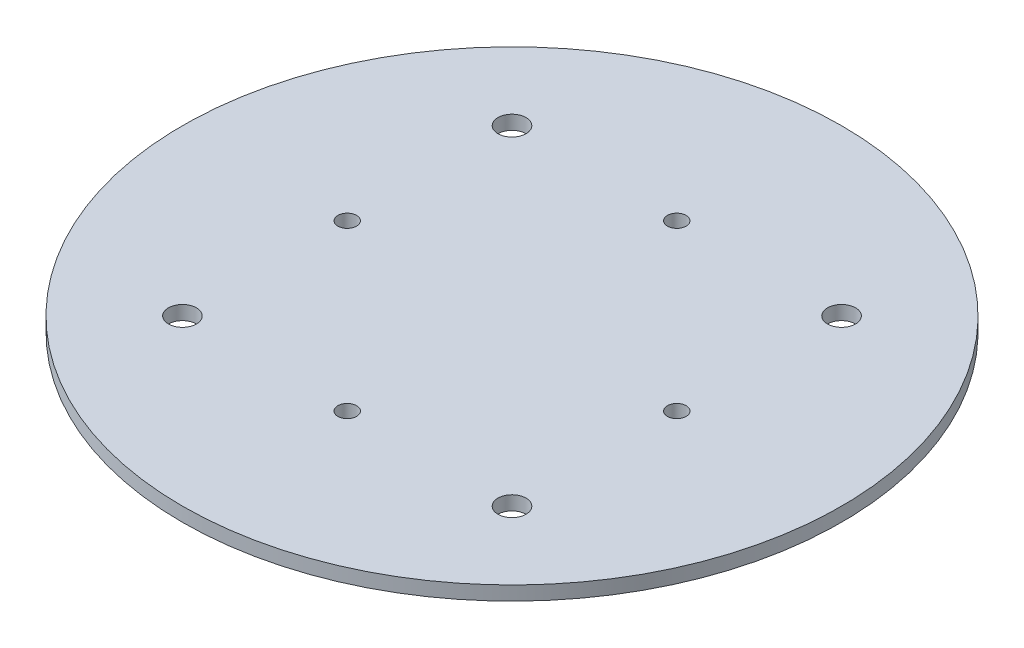
ISO-10303-21;
HEADER;
FILE_DESCRIPTION(('STEP AP214'),'2;1');
FILE_NAME('part.step','',(''),(''),'','','');
FILE_SCHEMA(('AUTOMOTIVE_DESIGN { 1 0 10303 214 1 1 1 1 }'));
ENDSEC;
DATA;
#1=APPLICATION_CONTEXT('core data for automotive mechanical design processes');
#2=APPLICATION_PROTOCOL_DEFINITION('international standard','automotive_design',2000,#1);
#3=PRODUCT_CONTEXT('',#1,'mechanical');
#4=PRODUCT('Part','Part','',(#3));
#5=PRODUCT_RELATED_PRODUCT_CATEGORY('part','',(#4));
#6=PRODUCT_DEFINITION_FORMATION('','',#4);
#7=PRODUCT_DEFINITION_CONTEXT('part definition',#1,'design');
#8=PRODUCT_DEFINITION('design','',#6,#7);
#9=PRODUCT_DEFINITION_SHAPE('','',#8);
#10=(LENGTH_UNIT() NAMED_UNIT(*) SI_UNIT(.MILLI.,.METRE.));
#11=(NAMED_UNIT(*) PLANE_ANGLE_UNIT() SI_UNIT($,.RADIAN.));
#12=(NAMED_UNIT(*) SI_UNIT($,.STERADIAN.) SOLID_ANGLE_UNIT());
#13=UNCERTAINTY_MEASURE_WITH_UNIT(LENGTH_MEASURE(1.E-05),#10,'distance_accuracy_value','');
#14=(GEOMETRIC_REPRESENTATION_CONTEXT(3) GLOBAL_UNCERTAINTY_ASSIGNED_CONTEXT((#13)) GLOBAL_UNIT_ASSIGNED_CONTEXT((#10,
#11,#12)) REPRESENTATION_CONTEXT('',''));
#15=CARTESIAN_POINT('',(0.,0.,0.));
#16=DIRECTION('',(0.,0.,1.));
#17=DIRECTION('',(1.,0.,0.));
#18=AXIS2_PLACEMENT_3D('',#15,#16,#17);
#19=CARTESIAN_POINT('',(0.,3.,0.));
#20=DIRECTION('',(0.,-1.,0.));
#21=DIRECTION('',(0.,0.,-1.));
#22=AXIS2_PLACEMENT_3D('',#19,#20,#21);
#23=CYLINDRICAL_SURFACE('',#22,70.4999999999991);
#24=CARTESIAN_POINT('',(0.,3.,0.));
#25=DIRECTION('',(0.,1.,0.));
#26=DIRECTION('',(0.,0.,1.));
#27=AXIS2_PLACEMENT_3D('',#24,#25,#26);
#28=CIRCLE('',#27,70.4999999999991);
#29=CARTESIAN_POINT('',(0.,3.,70.4999999999991));
#30=VERTEX_POINT('',#29);
#31=EDGE_CURVE('E10',#30,#30,#28,.T.);
#32=ORIENTED_EDGE('',*,*,#31,.F.);
#33=EDGE_LOOP('',(#32));
#34=FACE_BOUND('',#33,.T.);
#35=CARTESIAN_POINT('',(0.,0.,0.));
#36=DIRECTION('',(0.,1.,0.));
#37=DIRECTION('',(0.,0.,1.));
#38=AXIS2_PLACEMENT_3D('',#35,#36,#37);
#39=CIRCLE('',#38,70.4999999999991);
#40=CARTESIAN_POINT('',(0.,0.,70.4999999999991));
#41=VERTEX_POINT('',#40);
#42=EDGE_CURVE('E34',#41,#41,#39,.T.);
#43=ORIENTED_EDGE('',*,*,#42,.T.);
#44=EDGE_LOOP('',(#43));
#45=FACE_BOUND('',#44,.T.);
#46=ADVANCED_FACE('F31',(#34,#45),#23,.T.);
#47=CARTESIAN_POINT('',(0.,3.,0.));
#48=DIRECTION('',(0.,1.,0.));
#49=DIRECTION('',(0.,0.,1.));
#50=AXIS2_PLACEMENT_3D('',#47,#48,#49);
#51=PLANE('',#50);
#52=CARTESIAN_POINT('',(-35.2499999999991,3.,-35.2499999999991));
#53=DIRECTION('',(0.,-1.,0.));
#54=DIRECTION('',(0.,0.,-1.));
#55=AXIS2_PLACEMENT_3D('',#52,#53,#54);
#56=CIRCLE('',#55,3.);
#57=CARTESIAN_POINT('',(-35.2499999999991,3.,-38.2499999999991));
#58=VERTEX_POINT('',#57);
#59=EDGE_CURVE('E70',#58,#58,#56,.T.);
#60=ORIENTED_EDGE('',*,*,#59,.T.);
#61=EDGE_LOOP('',(#60));
#62=FACE_BOUND('',#61,.T.);
#63=CARTESIAN_POINT('',(35.2499999999991,3.,-35.2499999999991));
#64=DIRECTION('',(0.,-1.,0.));
#65=DIRECTION('',(0.,0.,-1.));
#66=AXIS2_PLACEMENT_3D('',#63,#64,#65);
#67=CIRCLE('',#66,3.00000000000001);
#68=CARTESIAN_POINT('',(35.2499999999991,3.,-38.2499999999991));
#69=VERTEX_POINT('',#68);
#70=EDGE_CURVE('E76',#69,#69,#67,.T.);
#71=ORIENTED_EDGE('',*,*,#70,.T.);
#72=EDGE_LOOP('',(#71));
#73=FACE_BOUND('',#72,.T.);
#74=CARTESIAN_POINT('',(0.,3.,35.2499999999991));
#75=DIRECTION('',(0.,-1.,0.));
#76=DIRECTION('',(0.,0.,-1.));
#77=AXIS2_PLACEMENT_3D('',#74,#75,#76);
#78=CIRCLE('',#77,2.);
#79=CARTESIAN_POINT('',(0.,3.,33.2499999999991));
#80=VERTEX_POINT('',#79);
#81=EDGE_CURVE('E82',#80,#80,#78,.T.);
#82=ORIENTED_EDGE('',*,*,#81,.T.);
#83=EDGE_LOOP('',(#82));
#84=FACE_BOUND('',#83,.T.);
#85=CARTESIAN_POINT('',(35.2499999999991,3.,35.2499999999991));
#86=DIRECTION('',(0.,-1.,0.));
#87=DIRECTION('',(0.,0.,-1.));
#88=AXIS2_PLACEMENT_3D('',#85,#86,#87);
#89=CIRCLE('',#88,3.);
#90=CARTESIAN_POINT('',(35.2499999999991,3.,32.2499999999991));
#91=VERTEX_POINT('',#90);
#92=EDGE_CURVE('E53',#91,#91,#89,.T.);
#93=ORIENTED_EDGE('',*,*,#92,.T.);
#94=EDGE_LOOP('',(#93));
#95=FACE_BOUND('',#94,.T.);
#96=CARTESIAN_POINT('',(35.2499999999991,3.,0.));
#97=DIRECTION('',(0.,-1.,0.));
#98=DIRECTION('',(0.,0.,-1.));
#99=AXIS2_PLACEMENT_3D('',#96,#97,#98);
#100=CIRCLE('',#99,2.);
#101=CARTESIAN_POINT('',(35.2499999999991,3.,-2.));
#102=VERTEX_POINT('',#101);
#103=EDGE_CURVE('E52',#102,#102,#100,.T.);
#104=ORIENTED_EDGE('',*,*,#103,.T.);
#105=EDGE_LOOP('',(#104));
#106=FACE_BOUND('',#105,.T.);
#107=CARTESIAN_POINT('',(0.,3.,-35.2499999999991));
#108=DIRECTION('',(0.,-1.,0.));
#109=DIRECTION('',(0.,0.,-1.));
#110=AXIS2_PLACEMENT_3D('',#107,#108,#109);
#111=CIRCLE('',#110,2.00000000000001);
#112=CARTESIAN_POINT('',(0.,3.,-37.2499999999991));
#113=VERTEX_POINT('',#112);
#114=EDGE_CURVE('E59',#113,#113,#111,.T.);
#115=ORIENTED_EDGE('',*,*,#114,.T.);
#116=EDGE_LOOP('',(#115));
#117=FACE_BOUND('',#116,.T.);
#118=CARTESIAN_POINT('',(-35.2499999999991,3.,35.2499999999991));
#119=DIRECTION('',(0.,-1.,0.));
#120=DIRECTION('',(0.,0.,-1.));
#121=AXIS2_PLACEMENT_3D('',#118,#119,#120);
#122=CIRCLE('',#121,3.);
#123=CARTESIAN_POINT('',(-35.2499999999991,3.,32.2499999999991));
#124=VERTEX_POINT('',#123);
#125=EDGE_CURVE('E46',#124,#124,#122,.T.);
#126=ORIENTED_EDGE('',*,*,#125,.T.);
#127=EDGE_LOOP('',(#126));
#128=FACE_BOUND('',#127,.T.);
#129=CARTESIAN_POINT('',(-35.2499999999991,3.,0.));
#130=DIRECTION('',(0.,-1.,0.));
#131=DIRECTION('',(0.,0.,-1.));
#132=AXIS2_PLACEMENT_3D('',#129,#130,#131);
#133=CIRCLE('',#132,2.);
#134=CARTESIAN_POINT('',(-35.2499999999991,3.,-2.));
#135=VERTEX_POINT('',#134);
#136=EDGE_CURVE('E41',#135,#135,#133,.T.);
#137=ORIENTED_EDGE('',*,*,#136,.T.);
#138=EDGE_LOOP('',(#137));
#139=FACE_BOUND('',#138,.T.);
#140=ORIENTED_EDGE('',*,*,#31,.T.);
#141=EDGE_LOOP('',(#140));
#142=FACE_BOUND('',#141,.T.);
#143=ADVANCED_FACE('F91',(#62,#73,#84,#95,#106,#117,#128,#139,#142),#51,.T.);
#144=CARTESIAN_POINT('',(0.,0.,0.));
#145=DIRECTION('',(0.,1.,0.));
#146=DIRECTION('',(0.,0.,1.));
#147=AXIS2_PLACEMENT_3D('',#144,#145,#146);
#148=PLANE('',#147);
#149=CARTESIAN_POINT('',(-35.2499999999991,0.,-35.2499999999991));
#150=DIRECTION('',(0.,-1.,0.));
#151=DIRECTION('',(0.,0.,-1.));
#152=AXIS2_PLACEMENT_3D('',#149,#150,#151);
#153=CIRCLE('',#152,3.);
#154=CARTESIAN_POINT('',(-35.2499999999991,0.,-38.2499999999991));
#155=VERTEX_POINT('',#154);
#156=EDGE_CURVE('E67',#155,#155,#153,.T.);
#157=ORIENTED_EDGE('',*,*,#156,.F.);
#158=EDGE_LOOP('',(#157));
#159=FACE_BOUND('',#158,.T.);
#160=CARTESIAN_POINT('',(35.2499999999991,0.,-35.2499999999991));
#161=DIRECTION('',(0.,-1.,0.));
#162=DIRECTION('',(0.,0.,-1.));
#163=AXIS2_PLACEMENT_3D('',#160,#161,#162);
#164=CIRCLE('',#163,3.00000000000001);
#165=CARTESIAN_POINT('',(35.2499999999991,0.,-38.2499999999991));
#166=VERTEX_POINT('',#165);
#167=EDGE_CURVE('E73',#166,#166,#164,.T.);
#168=ORIENTED_EDGE('',*,*,#167,.F.);
#169=EDGE_LOOP('',(#168));
#170=FACE_BOUND('',#169,.T.);
#171=CARTESIAN_POINT('',(0.,0.,35.2499999999991));
#172=DIRECTION('',(0.,-1.,0.));
#173=DIRECTION('',(0.,0.,-1.));
#174=AXIS2_PLACEMENT_3D('',#171,#172,#173);
#175=CIRCLE('',#174,2.);
#176=CARTESIAN_POINT('',(0.,0.,33.2499999999991));
#177=VERTEX_POINT('',#176);
#178=EDGE_CURVE('E79',#177,#177,#175,.T.);
#179=ORIENTED_EDGE('',*,*,#178,.F.);
#180=EDGE_LOOP('',(#179));
#181=FACE_BOUND('',#180,.T.);
#182=CARTESIAN_POINT('',(35.2499999999991,0.,35.2499999999991));
#183=DIRECTION('',(0.,-1.,0.));
#184=DIRECTION('',(0.,0.,-1.));
#185=AXIS2_PLACEMENT_3D('',#182,#183,#184);
#186=CIRCLE('',#185,3.);
#187=CARTESIAN_POINT('',(35.2499999999991,0.,32.2499999999991));
#188=VERTEX_POINT('',#187);
#189=EDGE_CURVE('E85',#188,#188,#186,.T.);
#190=ORIENTED_EDGE('',*,*,#189,.F.);
#191=EDGE_LOOP('',(#190));
#192=FACE_BOUND('',#191,.T.);
#193=CARTESIAN_POINT('',(35.2499999999991,0.,0.));
#194=DIRECTION('',(0.,-1.,0.));
#195=DIRECTION('',(0.,0.,-1.));
#196=AXIS2_PLACEMENT_3D('',#193,#194,#195);
#197=CIRCLE('',#196,2.);
#198=CARTESIAN_POINT('',(35.2499999999991,0.,-2.));
#199=VERTEX_POINT('',#198);
#200=EDGE_CURVE('E49',#199,#199,#197,.T.);
#201=ORIENTED_EDGE('',*,*,#200,.F.);
#202=EDGE_LOOP('',(#201));
#203=FACE_BOUND('',#202,.T.);
#204=CARTESIAN_POINT('',(0.,0.,-35.2499999999991));
#205=DIRECTION('',(0.,-1.,0.));
#206=DIRECTION('',(0.,0.,-1.));
#207=AXIS2_PLACEMENT_3D('',#204,#205,#206);
#208=CIRCLE('',#207,2.00000000000001);
#209=CARTESIAN_POINT('',(0.,0.,-37.2499999999991));
#210=VERTEX_POINT('',#209);
#211=EDGE_CURVE('E56',#210,#210,#208,.T.);
#212=ORIENTED_EDGE('',*,*,#211,.F.);
#213=EDGE_LOOP('',(#212));
#214=FACE_BOUND('',#213,.T.);
#215=CARTESIAN_POINT('',(-35.2499999999991,0.,35.2499999999991));
#216=DIRECTION('',(0.,-1.,0.));
#217=DIRECTION('',(0.,0.,-1.));
#218=AXIS2_PLACEMENT_3D('',#215,#216,#217);
#219=CIRCLE('',#218,3.);
#220=CARTESIAN_POINT('',(-35.2499999999991,0.,32.2499999999991));
#221=VERTEX_POINT('',#220);
#222=EDGE_CURVE('E62',#221,#221,#219,.T.);
#223=ORIENTED_EDGE('',*,*,#222,.F.);
#224=EDGE_LOOP('',(#223));
#225=FACE_BOUND('',#224,.T.);
#226=CARTESIAN_POINT('',(-35.2499999999991,0.,0.));
#227=DIRECTION('',(0.,-1.,0.));
#228=DIRECTION('',(0.,0.,-1.));
#229=AXIS2_PLACEMENT_3D('',#226,#227,#228);
#230=CIRCLE('',#229,2.);
#231=CARTESIAN_POINT('',(-35.2499999999991,0.,-2.));
#232=VERTEX_POINT('',#231);
#233=EDGE_CURVE('E43',#232,#232,#230,.T.);
#234=ORIENTED_EDGE('',*,*,#233,.F.);
#235=EDGE_LOOP('',(#234));
#236=FACE_BOUND('',#235,.T.);
#237=ORIENTED_EDGE('',*,*,#42,.F.);
#238=EDGE_LOOP('',(#237));
#239=FACE_BOUND('',#238,.T.);
#240=ADVANCED_FACE('F102',(#159,#170,#181,#192,#203,#214,#225,#236,#239),#148,.F.);
#241=CARTESIAN_POINT('',(-35.2499999999991,3.,0.));
#242=DIRECTION('',(0.,-1.,0.));
#243=DIRECTION('',(0.,0.,-1.));
#244=AXIS2_PLACEMENT_3D('',#241,#242,#243);
#245=CYLINDRICAL_SURFACE('',#244,2.);
#246=ORIENTED_EDGE('',*,*,#136,.F.);
#247=EDGE_LOOP('',(#246));
#248=FACE_BOUND('',#247,.T.);
#249=ORIENTED_EDGE('',*,*,#233,.T.);
#250=EDGE_LOOP('',(#249));
#251=FACE_BOUND('',#250,.T.);
#252=ADVANCED_FACE('F105',(#248,#251),#245,.F.);
#253=CARTESIAN_POINT('',(-35.2499999999991,3.,35.2499999999991));
#254=DIRECTION('',(0.,-1.,0.));
#255=DIRECTION('',(0.,0.,-1.));
#256=AXIS2_PLACEMENT_3D('',#253,#254,#255);
#257=CYLINDRICAL_SURFACE('',#256,3.);
#258=ORIENTED_EDGE('',*,*,#125,.F.);
#259=EDGE_LOOP('',(#258));
#260=FACE_BOUND('',#259,.T.);
#261=ORIENTED_EDGE('',*,*,#222,.T.);
#262=EDGE_LOOP('',(#261));
#263=FACE_BOUND('',#262,.T.);
#264=ADVANCED_FACE('F130',(#260,#263),#257,.F.);
#265=CARTESIAN_POINT('',(0.,3.,-35.2499999999991));
#266=DIRECTION('',(0.,-1.,0.));
#267=DIRECTION('',(0.,0.,-1.));
#268=AXIS2_PLACEMENT_3D('',#265,#266,#267);
#269=CYLINDRICAL_SURFACE('',#268,2.00000000000001);
#270=ORIENTED_EDGE('',*,*,#114,.F.);
#271=EDGE_LOOP('',(#270));
#272=FACE_BOUND('',#271,.T.);
#273=ORIENTED_EDGE('',*,*,#211,.T.);
#274=EDGE_LOOP('',(#273));
#275=FACE_BOUND('',#274,.T.);
#276=ADVANCED_FACE('F134',(#272,#275),#269,.F.);
#277=CARTESIAN_POINT('',(35.2499999999991,3.,0.));
#278=DIRECTION('',(0.,-1.,0.));
#279=DIRECTION('',(0.,0.,-1.));
#280=AXIS2_PLACEMENT_3D('',#277,#278,#279);
#281=CYLINDRICAL_SURFACE('',#280,2.);
#282=ORIENTED_EDGE('',*,*,#103,.F.);
#283=EDGE_LOOP('',(#282));
#284=FACE_BOUND('',#283,.T.);
#285=ORIENTED_EDGE('',*,*,#200,.T.);
#286=EDGE_LOOP('',(#285));
#287=FACE_BOUND('',#286,.T.);
#288=ADVANCED_FACE('F98',(#284,#287),#281,.F.);
#289=CARTESIAN_POINT('',(35.2499999999991,3.,35.2499999999991));
#290=DIRECTION('',(0.,-1.,0.));
#291=DIRECTION('',(0.,0.,-1.));
#292=AXIS2_PLACEMENT_3D('',#289,#290,#291);
#293=CYLINDRICAL_SURFACE('',#292,3.);
#294=ORIENTED_EDGE('',*,*,#92,.F.);
#295=EDGE_LOOP('',(#294));
#296=FACE_BOUND('',#295,.T.);
#297=ORIENTED_EDGE('',*,*,#189,.T.);
#298=EDGE_LOOP('',(#297));
#299=FACE_BOUND('',#298,.T.);
#300=ADVANCED_FACE('F94',(#296,#299),#293,.F.);
#301=CARTESIAN_POINT('',(0.,3.,35.2499999999991));
#302=DIRECTION('',(0.,-1.,0.));
#303=DIRECTION('',(0.,0.,-1.));
#304=AXIS2_PLACEMENT_3D('',#301,#302,#303);
#305=CYLINDRICAL_SURFACE('',#304,2.);
#306=ORIENTED_EDGE('',*,*,#81,.F.);
#307=EDGE_LOOP('',(#306));
#308=FACE_BOUND('',#307,.T.);
#309=ORIENTED_EDGE('',*,*,#178,.T.);
#310=EDGE_LOOP('',(#309));
#311=FACE_BOUND('',#310,.T.);
#312=ADVANCED_FACE('F97',(#308,#311),#305,.F.);
#313=CARTESIAN_POINT('',(35.2499999999991,3.,-35.2499999999991));
#314=DIRECTION('',(0.,-1.,0.));
#315=DIRECTION('',(0.,0.,-1.));
#316=AXIS2_PLACEMENT_3D('',#313,#314,#315);
#317=CYLINDRICAL_SURFACE('',#316,3.00000000000001);
#318=ORIENTED_EDGE('',*,*,#70,.F.);
#319=EDGE_LOOP('',(#318));
#320=FACE_BOUND('',#319,.T.);
#321=ORIENTED_EDGE('',*,*,#167,.T.);
#322=EDGE_LOOP('',(#321));
#323=FACE_BOUND('',#322,.T.);
#324=ADVANCED_FACE('F145',(#320,#323),#317,.F.);
#325=CARTESIAN_POINT('',(-35.2499999999991,3.,-35.2499999999991));
#326=DIRECTION('',(0.,-1.,0.));
#327=DIRECTION('',(0.,0.,-1.));
#328=AXIS2_PLACEMENT_3D('',#325,#326,#327);
#329=CYLINDRICAL_SURFACE('',#328,3.);
#330=ORIENTED_EDGE('',*,*,#59,.F.);
#331=EDGE_LOOP('',(#330));
#332=FACE_BOUND('',#331,.T.);
#333=ORIENTED_EDGE('',*,*,#156,.T.);
#334=EDGE_LOOP('',(#333));
#335=FACE_BOUND('',#334,.T.);
#336=ADVANCED_FACE('F142',(#332,#335),#329,.F.);
#337=CLOSED_SHELL('',(#46,#143,#240,#252,#264,#276,#288,#300,#312,#324,#336));
#338=MANIFOLD_SOLID_BREP('B2',#337);
#339=ADVANCED_BREP_SHAPE_REPRESENTATION('',(#18,#338),#14);
#340=SHAPE_DEFINITION_REPRESENTATION(#9,#339);
ENDSEC;
END-ISO-10303-21;
